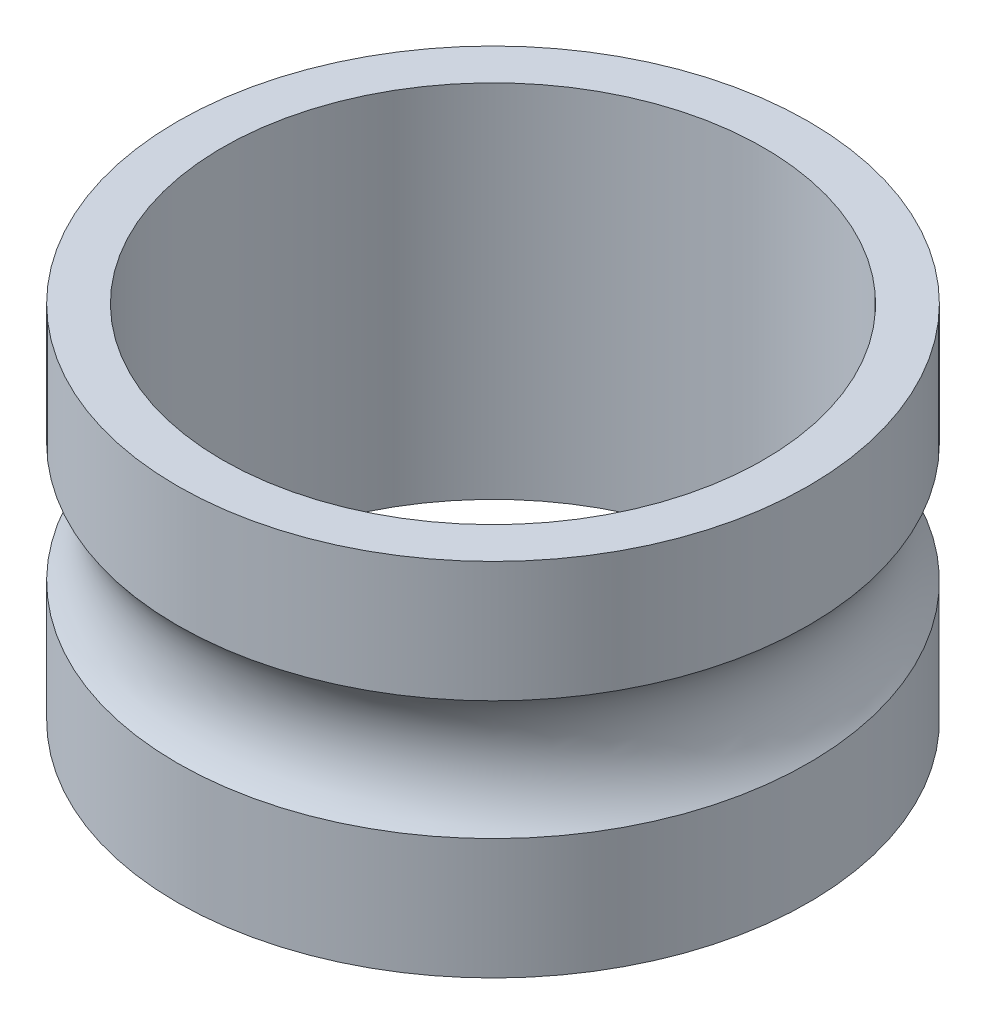
ISO-10303-21;
HEADER;
FILE_DESCRIPTION(('STEP AP214'),'2;1');
FILE_NAME('part.step','',(''),(''),'','','');
FILE_SCHEMA(('AUTOMOTIVE_DESIGN { 1 0 10303 214 1 1 1 1 }'));
ENDSEC;
DATA;
#1=APPLICATION_CONTEXT('core data for automotive mechanical design processes');
#2=APPLICATION_PROTOCOL_DEFINITION('international standard','automotive_design',2000,#1);
#3=PRODUCT_CONTEXT('',#1,'mechanical');
#4=PRODUCT('Part','Part','',(#3));
#5=PRODUCT_RELATED_PRODUCT_CATEGORY('part','',(#4));
#6=PRODUCT_DEFINITION_FORMATION('','',#4);
#7=PRODUCT_DEFINITION_CONTEXT('part definition',#1,'design');
#8=PRODUCT_DEFINITION('design','',#6,#7);
#9=PRODUCT_DEFINITION_SHAPE('','',#8);
#10=(LENGTH_UNIT() NAMED_UNIT(*) SI_UNIT(.MILLI.,.METRE.));
#11=(NAMED_UNIT(*) PLANE_ANGLE_UNIT() SI_UNIT($,.RADIAN.));
#12=(NAMED_UNIT(*) SI_UNIT($,.STERADIAN.) SOLID_ANGLE_UNIT());
#13=UNCERTAINTY_MEASURE_WITH_UNIT(LENGTH_MEASURE(1.E-05),#10,'distance_accuracy_value','');
#14=(GEOMETRIC_REPRESENTATION_CONTEXT(3) GLOBAL_UNCERTAINTY_ASSIGNED_CONTEXT((#13)) GLOBAL_UNIT_ASSIGNED_CONTEXT((#10,
#11,#12)) REPRESENTATION_CONTEXT('',''));
#15=CARTESIAN_POINT('',(0.,0.,0.));
#16=DIRECTION('',(0.,0.,1.));
#17=DIRECTION('',(1.,0.,0.));
#18=AXIS2_PLACEMENT_3D('',#15,#16,#17);
#19=CARTESIAN_POINT('',(0.,1.,0.));
#20=DIRECTION('',(0.,-1.,0.));
#21=DIRECTION('',(0.,0.,-1.));
#22=AXIS2_PLACEMENT_3D('',#19,#20,#21);
#23=CYLINDRICAL_SURFACE('',#22,1.75);
#24=CARTESIAN_POINT('',(0.,1.,0.));
#25=DIRECTION('',(0.,1.,0.));
#26=DIRECTION('',(0.,0.,1.));
#27=AXIS2_PLACEMENT_3D('',#24,#25,#26);
#28=CIRCLE('',#27,1.75);
#29=CARTESIAN_POINT('',(0.,1.,1.75));
#30=VERTEX_POINT('',#29);
#31=EDGE_CURVE('E10',#30,#30,#28,.T.);
#32=ORIENTED_EDGE('',*,*,#31,.F.);
#33=EDGE_LOOP('',(#32));
#34=FACE_BOUND('',#33,.T.);
#35=CARTESIAN_POINT('',(0.,0.330718913883074,0.));
#36=DIRECTION('',(0.,-1.,0.));
#37=DIRECTION('',(0.,0.,-1.));
#38=AXIS2_PLACEMENT_3D('',#35,#36,#37);
#39=CIRCLE('',#38,1.75);
#40=CARTESIAN_POINT('',(0.,0.330718913883074,-1.75));
#41=VERTEX_POINT('',#40);
#42=EDGE_CURVE('E35',#41,#41,#39,.T.);
#43=ORIENTED_EDGE('',*,*,#42,.F.);
#44=EDGE_LOOP('',(#43));
#45=FACE_BOUND('',#44,.T.);
#46=ADVANCED_FACE('F32',(#34,#45),#23,.T.);
#47=CARTESIAN_POINT('',(0.,-1.,0.));
#48=DIRECTION('',(0.,1.,0.));
#49=DIRECTION('',(0.,0.,1.));
#50=AXIS2_PLACEMENT_3D('',#47,#48,#49);
#51=CIRCLE('',#50,1.75);
#52=CARTESIAN_POINT('',(0.,-1.,1.75));
#53=VERTEX_POINT('',#52);
#54=EDGE_CURVE('E39',#53,#53,#51,.T.);
#55=ORIENTED_EDGE('',*,*,#54,.T.);
#56=EDGE_LOOP('',(#55));
#57=FACE_BOUND('',#56,.T.);
#58=CARTESIAN_POINT('',(0.,-0.330718913883074,0.));
#59=DIRECTION('',(0.,1.,0.));
#60=DIRECTION('',(0.,0.,1.));
#61=AXIS2_PLACEMENT_3D('',#58,#59,#60);
#62=CIRCLE('',#61,1.75);
#63=CARTESIAN_POINT('',(0.,-0.330718913883074,1.75));
#64=VERTEX_POINT('',#63);
#65=EDGE_CURVE('E49',#64,#64,#62,.T.);
#66=ORIENTED_EDGE('',*,*,#65,.F.);
#67=EDGE_LOOP('',(#66));
#68=FACE_BOUND('',#67,.T.);
#69=ADVANCED_FACE('F68',(#57,#68),#23,.T.);
#70=CARTESIAN_POINT('',(0.,1.,0.));
#71=DIRECTION('',(0.,1.,0.));
#72=DIRECTION('',(0.,0.,1.));
#73=AXIS2_PLACEMENT_3D('',#70,#71,#72);
#74=PLANE('',#73);
#75=ORIENTED_EDGE('',*,*,#31,.T.);
#76=EDGE_LOOP('',(#75));
#77=FACE_BOUND('',#76,.T.);
#78=CARTESIAN_POINT('',(0.,1.,0.));
#79=DIRECTION('',(0.,1.,0.));
#80=DIRECTION('',(0.,0.,1.));
#81=AXIS2_PLACEMENT_3D('',#78,#79,#80);
#82=CIRCLE('',#81,1.5);
#83=CARTESIAN_POINT('',(0.,1.,1.5));
#84=VERTEX_POINT('',#83);
#85=EDGE_CURVE('E44',#84,#84,#82,.T.);
#86=ORIENTED_EDGE('',*,*,#85,.F.);
#87=EDGE_LOOP('',(#86));
#88=FACE_BOUND('',#87,.T.);
#89=ADVANCED_FACE('F65',(#77,#88),#74,.T.);
#90=CARTESIAN_POINT('',(0.,-1.,0.));
#91=DIRECTION('',(0.,1.,0.));
#92=DIRECTION('',(0.,0.,1.));
#93=AXIS2_PLACEMENT_3D('',#90,#91,#92);
#94=PLANE('',#93);
#95=ORIENTED_EDGE('',*,*,#54,.F.);
#96=EDGE_LOOP('',(#95));
#97=FACE_BOUND('',#96,.T.);
#98=CARTESIAN_POINT('',(0.,-1.,0.));
#99=DIRECTION('',(0.,1.,0.));
#100=DIRECTION('',(0.,0.,1.));
#101=AXIS2_PLACEMENT_3D('',#98,#99,#100);
#102=CIRCLE('',#101,1.5);
#103=CARTESIAN_POINT('',(0.,-1.,1.5));
#104=VERTEX_POINT('',#103);
#105=EDGE_CURVE('E47',#104,#104,#102,.T.);
#106=ORIENTED_EDGE('',*,*,#105,.T.);
#107=EDGE_LOOP('',(#106));
#108=FACE_BOUND('',#107,.T.);
#109=ADVANCED_FACE('F67',(#97,#108),#94,.F.);
#110=CARTESIAN_POINT('',(0.,1.,0.));
#111=DIRECTION('',(0.,-1.,0.));
#112=DIRECTION('',(0.,0.,-1.));
#113=AXIS2_PLACEMENT_3D('',#110,#111,#112);
#114=CYLINDRICAL_SURFACE('',#113,1.5);
#115=ORIENTED_EDGE('',*,*,#85,.T.);
#116=EDGE_LOOP('',(#115));
#117=FACE_BOUND('',#116,.T.);
#118=ORIENTED_EDGE('',*,*,#105,.F.);
#119=EDGE_LOOP('',(#118));
#120=FACE_BOUND('',#119,.T.);
#121=ADVANCED_FACE('F62',(#117,#120),#114,.F.);
#122=CARTESIAN_POINT('',(0.,0.,0.));
#123=DIRECTION('',(0.,1.,0.));
#124=DIRECTION('',(0.,0.,1.));
#125=AXIS2_PLACEMENT_3D('',#122,#123,#124);
#126=TOROIDAL_SURFACE('',#125,2.125,0.5);
#127=ORIENTED_EDGE('',*,*,#65,.T.);
#128=EDGE_LOOP('',(#127));
#129=FACE_BOUND('',#128,.T.);
#130=ORIENTED_EDGE('',*,*,#42,.T.);
#131=EDGE_LOOP('',(#130));
#132=FACE_BOUND('',#131,.T.);
#133=ADVANCED_FACE('F93',(#129,#132),#126,.F.);
#134=CLOSED_SHELL('',(#46,#69,#89,#109,#121,#133));
#135=MANIFOLD_SOLID_BREP('B2',#134);
#136=ADVANCED_BREP_SHAPE_REPRESENTATION('',(#18,#135),#14);
#137=SHAPE_DEFINITION_REPRESENTATION(#9,#136);
ENDSEC;
END-ISO-10303-21;
